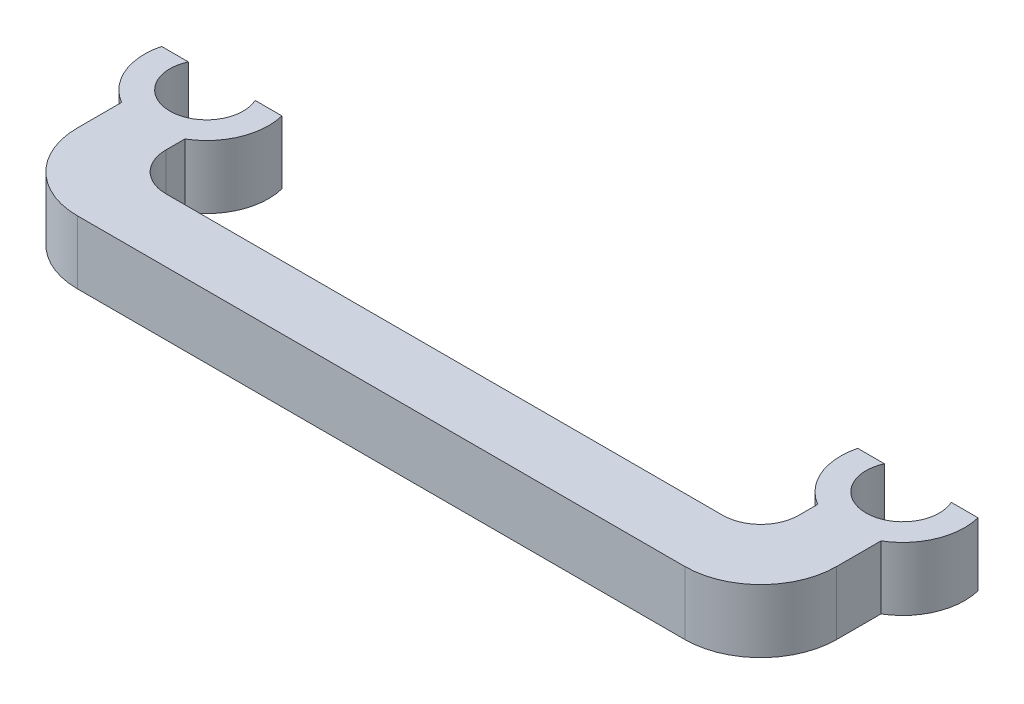
ISO-10303-21;
HEADER;
FILE_DESCRIPTION(('STEP AP214'),'2;1');
FILE_NAME('part.step','',(''),(''),'','','');
FILE_SCHEMA(('AUTOMOTIVE_DESIGN { 1 0 10303 214 1 1 1 1 }'));
ENDSEC;
DATA;
#1=APPLICATION_CONTEXT('core data for automotive mechanical design processes');
#2=APPLICATION_PROTOCOL_DEFINITION('international standard','automotive_design',2000,#1);
#3=PRODUCT_CONTEXT('',#1,'mechanical');
#4=PRODUCT('Part','Part','',(#3));
#5=PRODUCT_RELATED_PRODUCT_CATEGORY('part','',(#4));
#6=PRODUCT_DEFINITION_FORMATION('','',#4);
#7=PRODUCT_DEFINITION_CONTEXT('part definition',#1,'design');
#8=PRODUCT_DEFINITION('design','',#6,#7);
#9=PRODUCT_DEFINITION_SHAPE('','',#8);
#10=(LENGTH_UNIT() NAMED_UNIT(*) SI_UNIT(.MILLI.,.METRE.));
#11=(NAMED_UNIT(*) PLANE_ANGLE_UNIT() SI_UNIT($,.RADIAN.));
#12=(NAMED_UNIT(*) SI_UNIT($,.STERADIAN.) SOLID_ANGLE_UNIT());
#13=UNCERTAINTY_MEASURE_WITH_UNIT(LENGTH_MEASURE(1.E-05),#10,'distance_accuracy_value','');
#14=(GEOMETRIC_REPRESENTATION_CONTEXT(3) GLOBAL_UNCERTAINTY_ASSIGNED_CONTEXT((#13)) GLOBAL_UNIT_ASSIGNED_CONTEXT((#10,
#11,#12)) REPRESENTATION_CONTEXT('',''));
#15=CARTESIAN_POINT('',(0.,0.,0.));
#16=DIRECTION('',(0.,0.,1.));
#17=DIRECTION('',(1.,0.,0.));
#18=AXIS2_PLACEMENT_3D('',#15,#16,#17);
#19=CARTESIAN_POINT('',(-27.5,5.,-11.2142615011411));
#20=DIRECTION('',(0.,-1.,0.));
#21=DIRECTION('',(0.,0.,-1.));
#22=AXIS2_PLACEMENT_3D('',#19,#20,#21);
#23=CYLINDRICAL_SURFACE('',#22,4.9);
#24=CARTESIAN_POINT('',(-27.5,0.,-11.2142615011411));
#25=DIRECTION('',(0.,1.,0.));
#26=DIRECTION('',(0.,0.,1.));
#27=AXIS2_PLACEMENT_3D('',#24,#25,#26);
#28=CIRCLE('',#27,4.9);
#29=CARTESIAN_POINT('',(-32.2507894080879,0.,-12.4142615011411));
#30=VERTEX_POINT('',#29);
#31=CARTESIAN_POINT('',(-30.,0.,-7.));
#32=VERTEX_POINT('',#31);
#33=EDGE_CURVE('E191',#30,#32,#28,.T.);
#34=ORIENTED_EDGE('',*,*,#33,.T.);
#35=DIRECTION('',(0.,-1.,0.));
#36=VECTOR('',#35,1.);
#37=CARTESIAN_POINT('',(-30.,5.,-7.));
#38=LINE('',#37,#36);
#39=CARTESIAN_POINT('',(-30.,5.,-7.));
#40=VERTEX_POINT('',#39);
#41=EDGE_CURVE('E174',#40,#32,#38,.T.);
#42=ORIENTED_EDGE('',*,*,#41,.F.);
#43=CARTESIAN_POINT('',(-27.5,5.,-11.2142615011411));
#44=DIRECTION('',(0.,1.,0.));
#45=DIRECTION('',(0.,0.,1.));
#46=AXIS2_PLACEMENT_3D('',#43,#44,#45);
#47=CIRCLE('',#46,4.9);
#48=CARTESIAN_POINT('',(-32.2507894080879,5.,-12.4142615011411));
#49=VERTEX_POINT('',#48);
#50=EDGE_CURVE('E177',#49,#40,#47,.T.);
#51=ORIENTED_EDGE('',*,*,#50,.F.);
#52=DIRECTION('',(0.,-1.,0.));
#53=VECTOR('',#52,1.);
#54=CARTESIAN_POINT('',(-32.2507894080879,5.,-12.4142615011411));
#55=LINE('',#54,#53);
#56=EDGE_CURVE('E288',#49,#30,#55,.T.);
#57=ORIENTED_EDGE('',*,*,#56,.T.);
#58=EDGE_LOOP('',(#34,#42,#51,#57));
#59=FACE_BOUND('',#58,.T.);
#60=ADVANCED_FACE('F35',(#59),#23,.T.);
#61=CARTESIAN_POINT('',(-30.,5.,0.));
#62=DIRECTION('',(1.,0.,0.));
#63=DIRECTION('',(0.,0.,-1.));
#64=AXIS2_PLACEMENT_3D('',#61,#62,#63);
#65=PLANE('',#64);
#66=DIRECTION('',(0.,0.,1.));
#67=VECTOR('',#66,1.);
#68=CARTESIAN_POINT('',(-30.,0.,0.));
#69=LINE('',#68,#67);
#70=CARTESIAN_POINT('',(-30.,0.,-3.49999999999999));
#71=VERTEX_POINT('',#70);
#72=EDGE_CURVE('E254',#32,#71,#69,.T.);
#73=ORIENTED_EDGE('',*,*,#72,.T.);
#74=DIRECTION('',(0.,-1.,0.));
#75=VECTOR('',#74,1.);
#76=CARTESIAN_POINT('',(-30.,5.,-3.49999999999999));
#77=LINE('',#76,#75);
#78=CARTESIAN_POINT('',(-30.,5.,-3.49999999999999));
#79=VERTEX_POINT('',#78);
#80=EDGE_CURVE('E11',#71,#79,#77,.F.);
#81=ORIENTED_EDGE('',*,*,#80,.T.);
#82=DIRECTION('',(0.,0.,1.));
#83=VECTOR('',#82,1.);
#84=CARTESIAN_POINT('',(-30.,5.,0.));
#85=LINE('',#84,#83);
#86=EDGE_CURVE('E170',#40,#79,#85,.T.);
#87=ORIENTED_EDGE('',*,*,#86,.F.);
#88=ORIENTED_EDGE('',*,*,#41,.T.);
#89=EDGE_LOOP('',(#73,#81,#87,#88));
#90=FACE_BOUND('',#89,.T.);
#91=ADVANCED_FACE('F172',(#90),#65,.F.);
#92=CARTESIAN_POINT('',(0.,5.,2.50000000000001));
#93=DIRECTION('',(0.,0.,1.));
#94=DIRECTION('',(1.,0.,0.));
#95=AXIS2_PLACEMENT_3D('',#92,#93,#94);
#96=PLANE('',#95);
#97=DIRECTION('',(-1.,0.,0.));
#98=VECTOR('',#97,1.);
#99=CARTESIAN_POINT('',(0.,0.,2.50000000000001));
#100=LINE('',#99,#98);
#101=CARTESIAN_POINT('',(24.,0.,2.5));
#102=VERTEX_POINT('',#101);
#103=CARTESIAN_POINT('',(-24.,0.,2.50000000000001));
#104=VERTEX_POINT('',#103);
#105=EDGE_CURVE('E248',#102,#104,#100,.T.);
#106=ORIENTED_EDGE('',*,*,#105,.F.);
#107=DIRECTION('',(0.,-1.,0.));
#108=VECTOR('',#107,1.);
#109=CARTESIAN_POINT('',(24.,5.,2.5));
#110=LINE('',#109,#108);
#111=CARTESIAN_POINT('',(24.,5.,2.5));
#112=VERTEX_POINT('',#111);
#113=EDGE_CURVE('E226',#102,#112,#110,.F.);
#114=ORIENTED_EDGE('',*,*,#113,.T.);
#115=DIRECTION('',(-1.,0.,0.));
#116=VECTOR('',#115,1.);
#117=CARTESIAN_POINT('',(0.,5.,2.50000000000001));
#118=LINE('',#117,#116);
#119=CARTESIAN_POINT('',(-24.,5.,2.50000000000001));
#120=VERTEX_POINT('',#119);
#121=EDGE_CURVE('E176',#112,#120,#118,.T.);
#122=ORIENTED_EDGE('',*,*,#121,.T.);
#123=DIRECTION('',(0.,-1.,0.));
#124=VECTOR('',#123,1.);
#125=CARTESIAN_POINT('',(-24.,0.,2.50000000000001));
#126=LINE('',#125,#124);
#127=EDGE_CURVE('E223',#120,#104,#126,.T.);
#128=ORIENTED_EDGE('',*,*,#127,.T.);
#129=EDGE_LOOP('',(#106,#114,#122,#128));
#130=FACE_BOUND('',#129,.T.);
#131=ADVANCED_FACE('F252',(#130),#96,.T.);
#132=CARTESIAN_POINT('',(30.,5.,0.));
#133=DIRECTION('',(1.,0.,0.));
#134=DIRECTION('',(0.,0.,-1.));
#135=AXIS2_PLACEMENT_3D('',#132,#133,#134);
#136=PLANE('',#135);
#137=DIRECTION('',(0.,0.,1.));
#138=VECTOR('',#137,1.);
#139=CARTESIAN_POINT('',(30.,5.,0.));
#140=LINE('',#139,#138);
#141=CARTESIAN_POINT('',(30.,5.,-7.));
#142=VERTEX_POINT('',#141);
#143=CARTESIAN_POINT('',(30.,5.,-3.5));
#144=VERTEX_POINT('',#143);
#145=EDGE_CURVE('E232',#142,#144,#140,.T.);
#146=ORIENTED_EDGE('',*,*,#145,.T.);
#147=DIRECTION('',(0.,-1.,0.));
#148=VECTOR('',#147,1.);
#149=CARTESIAN_POINT('',(30.,5.,-3.5));
#150=LINE('',#149,#148);
#151=CARTESIAN_POINT('',(30.,0.,-3.5));
#152=VERTEX_POINT('',#151);
#153=EDGE_CURVE('E216',#144,#152,#150,.T.);
#154=ORIENTED_EDGE('',*,*,#153,.T.);
#155=DIRECTION('',(0.,0.,1.));
#156=VECTOR('',#155,1.);
#157=CARTESIAN_POINT('',(30.,0.,0.));
#158=LINE('',#157,#156);
#159=CARTESIAN_POINT('',(30.,0.,-7.));
#160=VERTEX_POINT('',#159);
#161=EDGE_CURVE('E250',#160,#152,#158,.T.);
#162=ORIENTED_EDGE('',*,*,#161,.F.);
#163=DIRECTION('',(0.,-1.,0.));
#164=VECTOR('',#163,1.);
#165=CARTESIAN_POINT('',(30.,5.,-7.));
#166=LINE('',#165,#164);
#167=EDGE_CURVE('E193',#142,#160,#166,.T.);
#168=ORIENTED_EDGE('',*,*,#167,.F.);
#169=EDGE_LOOP('',(#146,#154,#162,#168));
#170=FACE_BOUND('',#169,.T.);
#171=ADVANCED_FACE('F238',(#170),#136,.T.);
#172=CARTESIAN_POINT('',(27.5,5.,-11.2142615011411));
#173=DIRECTION('',(0.,-1.,0.));
#174=DIRECTION('',(0.,0.,-1.));
#175=AXIS2_PLACEMENT_3D('',#172,#173,#174);
#176=CYLINDRICAL_SURFACE('',#175,4.9);
#177=CARTESIAN_POINT('',(27.5,0.,-11.2142615011411));
#178=DIRECTION('',(0.,1.,0.));
#179=DIRECTION('',(0.,0.,1.));
#180=AXIS2_PLACEMENT_3D('',#177,#178,#179);
#181=CIRCLE('',#180,4.9);
#182=CARTESIAN_POINT('',(32.2507894080879,0.,-12.4142615011411));
#183=VERTEX_POINT('',#182);
#184=EDGE_CURVE('E256',#183,#160,#181,.F.);
#185=ORIENTED_EDGE('',*,*,#184,.F.);
#186=DIRECTION('',(0.,-1.,0.));
#187=VECTOR('',#186,1.);
#188=CARTESIAN_POINT('',(32.2507894080879,5.,-12.4142615011411));
#189=LINE('',#188,#187);
#190=CARTESIAN_POINT('',(32.2507894080879,5.,-12.4142615011411));
#191=VERTEX_POINT('',#190);
#192=EDGE_CURVE('E197',#191,#183,#189,.T.);
#193=ORIENTED_EDGE('',*,*,#192,.F.);
#194=CARTESIAN_POINT('',(27.5,5.,-11.2142615011411));
#195=DIRECTION('',(0.,1.,0.));
#196=DIRECTION('',(0.,0.,1.));
#197=AXIS2_PLACEMENT_3D('',#194,#195,#196);
#198=CIRCLE('',#197,4.9);
#199=EDGE_CURVE('E241',#191,#142,#198,.F.);
#200=ORIENTED_EDGE('',*,*,#199,.T.);
#201=ORIENTED_EDGE('',*,*,#167,.T.);
#202=EDGE_LOOP('',(#185,#193,#200,#201));
#203=FACE_BOUND('',#202,.T.);
#204=ADVANCED_FACE('F314',(#203),#176,.T.);
#205=CARTESIAN_POINT('',(0.,5.,-12.4142615011411));
#206=DIRECTION('',(0.,0.,-1.));
#207=DIRECTION('',(-1.,0.,0.));
#208=AXIS2_PLACEMENT_3D('',#205,#206,#207);
#209=PLANE('',#208);
#210=DIRECTION('',(1.,0.,0.));
#211=VECTOR('',#210,1.);
#212=CARTESIAN_POINT('',(0.,0.,-12.4142615011411));
#213=LINE('',#212,#211);
#214=CARTESIAN_POINT('',(30.1400757564888,0.,-12.4142615011411));
#215=VERTEX_POINT('',#214);
#216=EDGE_CURVE('E262',#215,#183,#213,.T.);
#217=ORIENTED_EDGE('',*,*,#216,.F.);
#218=DIRECTION('',(0.,-1.,0.));
#219=VECTOR('',#218,1.);
#220=CARTESIAN_POINT('',(30.1400757564888,5.,-12.4142615011411));
#221=LINE('',#220,#219);
#222=CARTESIAN_POINT('',(30.1400757564888,5.,-12.4142615011411));
#223=VERTEX_POINT('',#222);
#224=EDGE_CURVE('E305',#223,#215,#221,.T.);
#225=ORIENTED_EDGE('',*,*,#224,.F.);
#226=DIRECTION('',(1.,0.,0.));
#227=VECTOR('',#226,1.);
#228=CARTESIAN_POINT('',(0.,5.,-12.4142615011411));
#229=LINE('',#228,#227);
#230=EDGE_CURVE('E312',#223,#191,#229,.T.);
#231=ORIENTED_EDGE('',*,*,#230,.T.);
#232=ORIENTED_EDGE('',*,*,#192,.T.);
#233=EDGE_LOOP('',(#217,#225,#231,#232));
#234=FACE_BOUND('',#233,.T.);
#235=ADVANCED_FACE('F310',(#234),#209,.T.);
#236=CARTESIAN_POINT('',(27.5,5.,-11.2142615011411));
#237=DIRECTION('',(0.,-1.,0.));
#238=DIRECTION('',(0.,0.,-1.));
#239=AXIS2_PLACEMENT_3D('',#236,#237,#238);
#240=CYLINDRICAL_SURFACE('',#239,2.9);
#241=CARTESIAN_POINT('',(27.5,0.,-11.2142615011411));
#242=DIRECTION('',(0.,1.,0.));
#243=DIRECTION('',(0.,0.,1.));
#244=AXIS2_PLACEMENT_3D('',#241,#242,#243);
#245=CIRCLE('',#244,2.9);
#246=CARTESIAN_POINT('',(24.8599242435112,0.,-12.4142615011411));
#247=VERTEX_POINT('',#246);
#248=EDGE_CURVE('E266',#215,#247,#245,.F.);
#249=ORIENTED_EDGE('',*,*,#248,.T.);
#250=DIRECTION('',(0.,-1.,0.));
#251=VECTOR('',#250,1.);
#252=CARTESIAN_POINT('',(24.8599242435112,5.,-12.4142615011411));
#253=LINE('',#252,#251);
#254=CARTESIAN_POINT('',(24.8599242435112,5.,-12.4142615011411));
#255=VERTEX_POINT('',#254);
#256=EDGE_CURVE('E302',#255,#247,#253,.T.);
#257=ORIENTED_EDGE('',*,*,#256,.F.);
#258=CARTESIAN_POINT('',(27.5,5.,-11.2142615011411));
#259=DIRECTION('',(0.,1.,0.));
#260=DIRECTION('',(0.,0.,1.));
#261=AXIS2_PLACEMENT_3D('',#258,#259,#260);
#262=CIRCLE('',#261,2.9);
#263=EDGE_CURVE('E330',#223,#255,#262,.F.);
#264=ORIENTED_EDGE('',*,*,#263,.F.);
#265=ORIENTED_EDGE('',*,*,#224,.T.);
#266=EDGE_LOOP('',(#249,#257,#264,#265));
#267=FACE_BOUND('',#266,.T.);
#268=ADVANCED_FACE('F320',(#267),#240,.F.);
#269=CARTESIAN_POINT('',(0.,5.,-12.4142615011411));
#270=DIRECTION('',(0.,0.,1.));
#271=DIRECTION('',(1.,0.,0.));
#272=AXIS2_PLACEMENT_3D('',#269,#270,#271);
#273=PLANE('',#272);
#274=DIRECTION('',(-1.,0.,0.));
#275=VECTOR('',#274,1.);
#276=CARTESIAN_POINT('',(0.,0.,-12.4142615011411));
#277=LINE('',#276,#275);
#278=CARTESIAN_POINT('',(22.7492105919121,0.,-12.4142615011411));
#279=VERTEX_POINT('',#278);
#280=EDGE_CURVE('E268',#247,#279,#277,.T.);
#281=ORIENTED_EDGE('',*,*,#280,.T.);
#282=DIRECTION('',(0.,-1.,0.));
#283=VECTOR('',#282,1.);
#284=CARTESIAN_POINT('',(22.7492105919121,5.,-12.4142615011411));
#285=LINE('',#284,#283);
#286=CARTESIAN_POINT('',(22.7492105919121,5.,-12.4142615011411));
#287=VERTEX_POINT('',#286);
#288=EDGE_CURVE('E300',#287,#279,#285,.T.);
#289=ORIENTED_EDGE('',*,*,#288,.F.);
#290=DIRECTION('',(-1.,0.,0.));
#291=VECTOR('',#290,1.);
#292=CARTESIAN_POINT('',(0.,5.,-12.4142615011411));
#293=LINE('',#292,#291);
#294=EDGE_CURVE('E326',#255,#287,#293,.T.);
#295=ORIENTED_EDGE('',*,*,#294,.F.);
#296=ORIENTED_EDGE('',*,*,#256,.T.);
#297=EDGE_LOOP('',(#281,#289,#295,#296));
#298=FACE_BOUND('',#297,.T.);
#299=ADVANCED_FACE('F324',(#298),#273,.F.);
#300=CARTESIAN_POINT('',(25.,0.,-7.));
#301=VERTEX_POINT('',#300);
#302=EDGE_CURVE('E263',#301,#279,#181,.F.);
#303=ORIENTED_EDGE('',*,*,#302,.F.);
#304=DIRECTION('',(0.,-1.,0.));
#305=VECTOR('',#304,1.);
#306=CARTESIAN_POINT('',(25.,5.,-7.));
#307=LINE('',#306,#305);
#308=CARTESIAN_POINT('',(25.,5.,-7.));
#309=VERTEX_POINT('',#308);
#310=EDGE_CURVE('E298',#309,#301,#307,.T.);
#311=ORIENTED_EDGE('',*,*,#310,.F.);
#312=EDGE_CURVE('E329',#309,#287,#198,.F.);
#313=ORIENTED_EDGE('',*,*,#312,.T.);
#314=ORIENTED_EDGE('',*,*,#288,.T.);
#315=EDGE_LOOP('',(#303,#311,#313,#314));
#316=FACE_BOUND('',#315,.T.);
#317=ADVANCED_FACE('F400',(#316),#176,.T.);
#318=CARTESIAN_POINT('',(25.,5.,0.));
#319=DIRECTION('',(1.,0.,0.));
#320=DIRECTION('',(0.,0.,-1.));
#321=AXIS2_PLACEMENT_3D('',#318,#319,#320);
#322=PLANE('',#321);
#323=DIRECTION('',(0.,0.,1.));
#324=VECTOR('',#323,1.);
#325=CARTESIAN_POINT('',(25.,0.,0.));
#326=LINE('',#325,#324);
#327=CARTESIAN_POINT('',(25.,0.,-5.5));
#328=VERTEX_POINT('',#327);
#329=EDGE_CURVE('E271',#301,#328,#326,.T.);
#330=ORIENTED_EDGE('',*,*,#329,.T.);
#331=DIRECTION('',(0.,-1.,0.));
#332=VECTOR('',#331,1.);
#333=CARTESIAN_POINT('',(25.,5.,-5.5));
#334=LINE('',#333,#332);
#335=CARTESIAN_POINT('',(25.,5.,-5.5));
#336=VERTEX_POINT('',#335);
#337=EDGE_CURVE('E203',#328,#336,#334,.F.);
#338=ORIENTED_EDGE('',*,*,#337,.T.);
#339=DIRECTION('',(0.,0.,1.));
#340=VECTOR('',#339,1.);
#341=CARTESIAN_POINT('',(25.,5.,0.));
#342=LINE('',#341,#340);
#343=EDGE_CURVE('E332',#309,#336,#342,.T.);
#344=ORIENTED_EDGE('',*,*,#343,.F.);
#345=ORIENTED_EDGE('',*,*,#310,.T.);
#346=EDGE_LOOP('',(#330,#338,#344,#345));
#347=FACE_BOUND('',#346,.T.);
#348=ADVANCED_FACE('F394',(#347),#322,.F.);
#349=CARTESIAN_POINT('',(0.,5.,-2.5));
#350=DIRECTION('',(0.,0.,1.));
#351=DIRECTION('',(1.,0.,0.));
#352=AXIS2_PLACEMENT_3D('',#349,#350,#351);
#353=PLANE('',#352);
#354=DIRECTION('',(-1.,0.,0.));
#355=VECTOR('',#354,1.);
#356=CARTESIAN_POINT('',(0.,5.,-2.5));
#357=LINE('',#356,#355);
#358=CARTESIAN_POINT('',(22.,5.,-2.5));
#359=VERTEX_POINT('',#358);
#360=CARTESIAN_POINT('',(-22.,5.,-2.5));
#361=VERTEX_POINT('',#360);
#362=EDGE_CURVE('E339',#359,#361,#357,.T.);
#363=ORIENTED_EDGE('',*,*,#362,.F.);
#364=DIRECTION('',(0.,-1.,0.));
#365=VECTOR('',#364,1.);
#366=CARTESIAN_POINT('',(22.,0.,-2.5));
#367=LINE('',#366,#365);
#368=CARTESIAN_POINT('',(22.,0.,-2.5));
#369=VERTEX_POINT('',#368);
#370=EDGE_CURVE('E195',#359,#369,#367,.T.);
#371=ORIENTED_EDGE('',*,*,#370,.T.);
#372=DIRECTION('',(-1.,0.,0.));
#373=VECTOR('',#372,1.);
#374=CARTESIAN_POINT('',(0.,0.,-2.5));
#375=LINE('',#374,#373);
#376=CARTESIAN_POINT('',(-22.,0.,-2.5));
#377=VERTEX_POINT('',#376);
#378=EDGE_CURVE('E274',#369,#377,#375,.T.);
#379=ORIENTED_EDGE('',*,*,#378,.T.);
#380=DIRECTION('',(0.,-1.,0.));
#381=VECTOR('',#380,1.);
#382=CARTESIAN_POINT('',(-22.,5.,-2.5));
#383=LINE('',#382,#381);
#384=EDGE_CURVE('E192',#377,#361,#383,.F.);
#385=ORIENTED_EDGE('',*,*,#384,.T.);
#386=EDGE_LOOP('',(#363,#371,#379,#385));
#387=FACE_BOUND('',#386,.T.);
#388=ADVANCED_FACE('F389',(#387),#353,.F.);
#389=CARTESIAN_POINT('',(-25.,5.,0.));
#390=DIRECTION('',(1.,0.,0.));
#391=DIRECTION('',(0.,0.,-1.));
#392=AXIS2_PLACEMENT_3D('',#389,#390,#391);
#393=PLANE('',#392);
#394=DIRECTION('',(0.,0.,1.));
#395=VECTOR('',#394,1.);
#396=CARTESIAN_POINT('',(-25.,5.,0.));
#397=LINE('',#396,#395);
#398=CARTESIAN_POINT('',(-25.,5.,-7.));
#399=VERTEX_POINT('',#398);
#400=CARTESIAN_POINT('',(-25.,5.,-5.49999999999999));
#401=VERTEX_POINT('',#400);
#402=EDGE_CURVE('E342',#399,#401,#397,.T.);
#403=ORIENTED_EDGE('',*,*,#402,.T.);
#404=DIRECTION('',(0.,-1.,0.));
#405=VECTOR('',#404,1.);
#406=CARTESIAN_POINT('',(-25.,5.,-5.49999999999999));
#407=LINE('',#406,#405);
#408=CARTESIAN_POINT('',(-25.,0.,-5.49999999999999));
#409=VERTEX_POINT('',#408);
#410=EDGE_CURVE('E205',#401,#409,#407,.T.);
#411=ORIENTED_EDGE('',*,*,#410,.T.);
#412=DIRECTION('',(0.,0.,1.));
#413=VECTOR('',#412,1.);
#414=CARTESIAN_POINT('',(-25.,0.,0.));
#415=LINE('',#414,#413);
#416=CARTESIAN_POINT('',(-25.,0.,-7.));
#417=VERTEX_POINT('',#416);
#418=EDGE_CURVE('E277',#417,#409,#415,.T.);
#419=ORIENTED_EDGE('',*,*,#418,.F.);
#420=DIRECTION('',(0.,-1.,0.));
#421=VECTOR('',#420,1.);
#422=CARTESIAN_POINT('',(-25.,5.,-7.));
#423=LINE('',#422,#421);
#424=EDGE_CURVE('E296',#399,#417,#423,.T.);
#425=ORIENTED_EDGE('',*,*,#424,.F.);
#426=EDGE_LOOP('',(#403,#411,#419,#425));
#427=FACE_BOUND('',#426,.T.);
#428=ADVANCED_FACE('F384',(#427),#393,.T.);
#429=CARTESIAN_POINT('',(-22.7492105919121,0.,-12.4142615011411));
#430=VERTEX_POINT('',#429);
#431=EDGE_CURVE('E280',#417,#430,#28,.T.);
#432=ORIENTED_EDGE('',*,*,#431,.T.);
#433=DIRECTION('',(0.,-1.,0.));
#434=VECTOR('',#433,1.);
#435=CARTESIAN_POINT('',(-22.7492105919121,5.,-12.4142615011411));
#436=LINE('',#435,#434);
#437=CARTESIAN_POINT('',(-22.7492105919121,5.,-12.4142615011411));
#438=VERTEX_POINT('',#437);
#439=EDGE_CURVE('E294',#438,#430,#436,.T.);
#440=ORIENTED_EDGE('',*,*,#439,.F.);
#441=EDGE_CURVE('E189',#399,#438,#47,.T.);
#442=ORIENTED_EDGE('',*,*,#441,.F.);
#443=ORIENTED_EDGE('',*,*,#424,.T.);
#444=EDGE_LOOP('',(#432,#440,#442,#443));
#445=FACE_BOUND('',#444,.T.);
#446=ADVANCED_FACE('F355',(#445),#23,.T.);
#447=CARTESIAN_POINT('',(0.,5.,-12.4142615011411));
#448=DIRECTION('',(0.,0.,-1.));
#449=DIRECTION('',(-1.,0.,0.));
#450=AXIS2_PLACEMENT_3D('',#447,#448,#449);
#451=PLANE('',#450);
#452=DIRECTION('',(1.,0.,0.));
#453=VECTOR('',#452,1.);
#454=CARTESIAN_POINT('',(0.,0.,-12.4142615011411));
#455=LINE('',#454,#453);
#456=CARTESIAN_POINT('',(-24.8599242435112,0.,-12.4142615011411));
#457=VERTEX_POINT('',#456);
#458=EDGE_CURVE('E281',#457,#430,#455,.T.);
#459=ORIENTED_EDGE('',*,*,#458,.F.);
#460=DIRECTION('',(0.,-1.,0.));
#461=VECTOR('',#460,1.);
#462=CARTESIAN_POINT('',(-24.8599242435112,5.,-12.4142615011411));
#463=LINE('',#462,#461);
#464=CARTESIAN_POINT('',(-24.8599242435112,5.,-12.4142615011411));
#465=VERTEX_POINT('',#464);
#466=EDGE_CURVE('E292',#465,#457,#463,.T.);
#467=ORIENTED_EDGE('',*,*,#466,.F.);
#468=DIRECTION('',(1.,0.,0.));
#469=VECTOR('',#468,1.);
#470=CARTESIAN_POINT('',(0.,5.,-12.4142615011411));
#471=LINE('',#470,#469);
#472=EDGE_CURVE('E345',#465,#438,#471,.T.);
#473=ORIENTED_EDGE('',*,*,#472,.T.);
#474=ORIENTED_EDGE('',*,*,#439,.T.);
#475=EDGE_LOOP('',(#459,#467,#473,#474));
#476=FACE_BOUND('',#475,.T.);
#477=ADVANCED_FACE('F362',(#476),#451,.T.);
#478=CARTESIAN_POINT('',(-27.5,5.,-11.2142615011411));
#479=DIRECTION('',(0.,-1.,0.));
#480=DIRECTION('',(0.,0.,-1.));
#481=AXIS2_PLACEMENT_3D('',#478,#479,#480);
#482=CYLINDRICAL_SURFACE('',#481,2.9);
#483=CARTESIAN_POINT('',(-27.5,0.,-11.2142615011411));
#484=DIRECTION('',(0.,1.,0.));
#485=DIRECTION('',(0.,0.,1.));
#486=AXIS2_PLACEMENT_3D('',#483,#484,#485);
#487=CIRCLE('',#486,2.9);
#488=CARTESIAN_POINT('',(-30.1400757564888,0.,-12.4142615011411));
#489=VERTEX_POINT('',#488);
#490=EDGE_CURVE('E284',#489,#457,#487,.T.);
#491=ORIENTED_EDGE('',*,*,#490,.F.);
#492=DIRECTION('',(0.,-1.,0.));
#493=VECTOR('',#492,1.);
#494=CARTESIAN_POINT('',(-30.1400757564888,5.,-12.4142615011411));
#495=LINE('',#494,#493);
#496=CARTESIAN_POINT('',(-30.1400757564888,5.,-12.4142615011411));
#497=VERTEX_POINT('',#496);
#498=EDGE_CURVE('E290',#497,#489,#495,.T.);
#499=ORIENTED_EDGE('',*,*,#498,.F.);
#500=CARTESIAN_POINT('',(-27.5,5.,-11.2142615011411));
#501=DIRECTION('',(0.,1.,0.));
#502=DIRECTION('',(0.,0.,1.));
#503=AXIS2_PLACEMENT_3D('',#500,#501,#502);
#504=CIRCLE('',#503,2.9);
#505=EDGE_CURVE('E348',#497,#465,#504,.T.);
#506=ORIENTED_EDGE('',*,*,#505,.T.);
#507=ORIENTED_EDGE('',*,*,#466,.T.);
#508=EDGE_LOOP('',(#491,#499,#506,#507));
#509=FACE_BOUND('',#508,.T.);
#510=ADVANCED_FACE('F366',(#509),#482,.F.);
#511=CARTESIAN_POINT('',(0.,5.,-12.4142615011411));
#512=DIRECTION('',(0.,0.,1.));
#513=DIRECTION('',(1.,0.,0.));
#514=AXIS2_PLACEMENT_3D('',#511,#512,#513);
#515=PLANE('',#514);
#516=DIRECTION('',(-1.,0.,0.));
#517=VECTOR('',#516,1.);
#518=CARTESIAN_POINT('',(0.,0.,-12.4142615011411));
#519=LINE('',#518,#517);
#520=EDGE_CURVE('E187',#489,#30,#519,.T.);
#521=ORIENTED_EDGE('',*,*,#520,.T.);
#522=ORIENTED_EDGE('',*,*,#56,.F.);
#523=DIRECTION('',(-1.,0.,0.));
#524=VECTOR('',#523,1.);
#525=CARTESIAN_POINT('',(0.,5.,-12.4142615011411));
#526=LINE('',#525,#524);
#527=EDGE_CURVE('E183',#497,#49,#526,.T.);
#528=ORIENTED_EDGE('',*,*,#527,.F.);
#529=ORIENTED_EDGE('',*,*,#498,.T.);
#530=EDGE_LOOP('',(#521,#522,#528,#529));
#531=FACE_BOUND('',#530,.T.);
#532=ADVANCED_FACE('F368',(#531),#515,.F.);
#533=CARTESIAN_POINT('',(0.,5.,0.));
#534=DIRECTION('',(0.,1.,0.));
#535=DIRECTION('',(0.,0.,1.));
#536=AXIS2_PLACEMENT_3D('',#533,#534,#535);
#537=PLANE('',#536);
#538=ORIENTED_EDGE('',*,*,#121,.F.);
#539=CARTESIAN_POINT('',(24.,5.,-3.5));
#540=DIRECTION('',(0.,1.,0.));
#541=DIRECTION('',(0.,0.,1.));
#542=AXIS2_PLACEMENT_3D('',#539,#540,#541);
#543=CIRCLE('',#542,6.);
#544=EDGE_CURVE('E43',#112,#144,#543,.T.);
#545=ORIENTED_EDGE('',*,*,#544,.T.);
#546=ORIENTED_EDGE('',*,*,#145,.F.);
#547=ORIENTED_EDGE('',*,*,#199,.F.);
#548=ORIENTED_EDGE('',*,*,#230,.F.);
#549=ORIENTED_EDGE('',*,*,#263,.T.);
#550=ORIENTED_EDGE('',*,*,#294,.T.);
#551=ORIENTED_EDGE('',*,*,#312,.F.);
#552=ORIENTED_EDGE('',*,*,#343,.T.);
#553=CARTESIAN_POINT('',(22.,5.,-5.5));
#554=DIRECTION('',(0.,1.,0.));
#555=DIRECTION('',(0.,0.,1.));
#556=AXIS2_PLACEMENT_3D('',#553,#554,#555);
#557=CIRCLE('',#556,3.);
#558=EDGE_CURVE('E210',#336,#359,#557,.F.);
#559=ORIENTED_EDGE('',*,*,#558,.T.);
#560=ORIENTED_EDGE('',*,*,#362,.T.);
#561=CARTESIAN_POINT('',(-22.,5.,-5.5));
#562=DIRECTION('',(0.,1.,0.));
#563=DIRECTION('',(0.,0.,1.));
#564=AXIS2_PLACEMENT_3D('',#561,#562,#563);
#565=CIRCLE('',#564,3.);
#566=EDGE_CURVE('E214',#361,#401,#565,.F.);
#567=ORIENTED_EDGE('',*,*,#566,.T.);
#568=ORIENTED_EDGE('',*,*,#402,.F.);
#569=ORIENTED_EDGE('',*,*,#441,.T.);
#570=ORIENTED_EDGE('',*,*,#472,.F.);
#571=ORIENTED_EDGE('',*,*,#505,.F.);
#572=ORIENTED_EDGE('',*,*,#527,.T.);
#573=ORIENTED_EDGE('',*,*,#50,.T.);
#574=ORIENTED_EDGE('',*,*,#86,.T.);
#575=CARTESIAN_POINT('',(-24.,5.,-3.49999999999999));
#576=DIRECTION('',(0.,1.,0.));
#577=DIRECTION('',(0.,0.,1.));
#578=AXIS2_PLACEMENT_3D('',#575,#576,#577);
#579=CIRCLE('',#578,6.);
#580=EDGE_CURVE('E55',#79,#120,#579,.T.);
#581=ORIENTED_EDGE('',*,*,#580,.T.);
#582=EDGE_LOOP('',(#538,#545,#546,#547,#548,#549,#550,#551,#552,#559,#560,#567,#568,#569,#570,
#571,#572,#573,#574,#581));
#583=FACE_BOUND('',#582,.T.);
#584=ADVANCED_FACE('F180',(#583),#537,.T.);
#585=CARTESIAN_POINT('',(0.,0.,0.));
#586=DIRECTION('',(0.,1.,0.));
#587=DIRECTION('',(0.,0.,1.));
#588=AXIS2_PLACEMENT_3D('',#585,#586,#587);
#589=PLANE('',#588);
#590=ORIENTED_EDGE('',*,*,#161,.T.);
#591=CARTESIAN_POINT('',(24.,0.,-3.5));
#592=DIRECTION('',(0.,1.,0.));
#593=DIRECTION('',(0.,0.,1.));
#594=AXIS2_PLACEMENT_3D('',#591,#592,#593);
#595=CIRCLE('',#594,6.);
#596=EDGE_CURVE('E221',#152,#102,#595,.F.);
#597=ORIENTED_EDGE('',*,*,#596,.T.);
#598=ORIENTED_EDGE('',*,*,#105,.T.);
#599=CARTESIAN_POINT('',(-24.,0.,-3.49999999999999));
#600=DIRECTION('',(0.,1.,0.));
#601=DIRECTION('',(0.,0.,1.));
#602=AXIS2_PLACEMENT_3D('',#599,#600,#601);
#603=CIRCLE('',#602,6.);
#604=EDGE_CURVE('E219',#104,#71,#603,.F.);
#605=ORIENTED_EDGE('',*,*,#604,.T.);
#606=ORIENTED_EDGE('',*,*,#72,.F.);
#607=ORIENTED_EDGE('',*,*,#33,.F.);
#608=ORIENTED_EDGE('',*,*,#520,.F.);
#609=ORIENTED_EDGE('',*,*,#490,.T.);
#610=ORIENTED_EDGE('',*,*,#458,.T.);
#611=ORIENTED_EDGE('',*,*,#431,.F.);
#612=ORIENTED_EDGE('',*,*,#418,.T.);
#613=CARTESIAN_POINT('',(-22.,0.,-5.5));
#614=DIRECTION('',(0.,1.,0.));
#615=DIRECTION('',(0.,0.,1.));
#616=AXIS2_PLACEMENT_3D('',#613,#614,#615);
#617=CIRCLE('',#616,3.);
#618=EDGE_CURVE('E212',#409,#377,#617,.T.);
#619=ORIENTED_EDGE('',*,*,#618,.T.);
#620=ORIENTED_EDGE('',*,*,#378,.F.);
#621=CARTESIAN_POINT('',(22.,0.,-5.5));
#622=DIRECTION('',(0.,1.,0.));
#623=DIRECTION('',(0.,0.,1.));
#624=AXIS2_PLACEMENT_3D('',#621,#622,#623);
#625=CIRCLE('',#624,3.);
#626=EDGE_CURVE('E208',#369,#328,#625,.T.);
#627=ORIENTED_EDGE('',*,*,#626,.T.);
#628=ORIENTED_EDGE('',*,*,#329,.F.);
#629=ORIENTED_EDGE('',*,*,#302,.T.);
#630=ORIENTED_EDGE('',*,*,#280,.F.);
#631=ORIENTED_EDGE('',*,*,#248,.F.);
#632=ORIENTED_EDGE('',*,*,#216,.T.);
#633=ORIENTED_EDGE('',*,*,#184,.T.);
#634=EDGE_LOOP('',(#590,#597,#598,#605,#606,#607,#608,#609,#610,#611,#612,#619,#620,#627,#628,
#629,#630,#631,#632,#633));
#635=FACE_BOUND('',#634,.T.);
#636=ADVANCED_FACE('F247',(#635),#589,.F.);
#637=CARTESIAN_POINT('',(22.,5.,-5.5));
#638=DIRECTION('',(0.,1.,0.));
#639=DIRECTION('',(0.,0.,1.));
#640=AXIS2_PLACEMENT_3D('',#637,#638,#639);
#641=CYLINDRICAL_SURFACE('',#640,3.);
#642=ORIENTED_EDGE('',*,*,#558,.F.);
#643=ORIENTED_EDGE('',*,*,#337,.F.);
#644=ORIENTED_EDGE('',*,*,#626,.F.);
#645=ORIENTED_EDGE('',*,*,#370,.F.);
#646=EDGE_LOOP('',(#642,#643,#644,#645));
#647=FACE_BOUND('',#646,.T.);
#648=ADVANCED_FACE('F415',(#647),#641,.F.);
#649=CARTESIAN_POINT('',(-22.,5.,-5.5));
#650=DIRECTION('',(0.,-1.,0.));
#651=DIRECTION('',(0.,0.,-1.));
#652=AXIS2_PLACEMENT_3D('',#649,#650,#651);
#653=CYLINDRICAL_SURFACE('',#652,3.);
#654=ORIENTED_EDGE('',*,*,#566,.F.);
#655=ORIENTED_EDGE('',*,*,#384,.F.);
#656=ORIENTED_EDGE('',*,*,#618,.F.);
#657=ORIENTED_EDGE('',*,*,#410,.F.);
#658=EDGE_LOOP('',(#654,#655,#656,#657));
#659=FACE_BOUND('',#658,.T.);
#660=ADVANCED_FACE('F374',(#659),#653,.F.);
#661=CARTESIAN_POINT('',(24.,5.,-3.5));
#662=DIRECTION('',(0.,-1.,0.));
#663=DIRECTION('',(0.,0.,-1.));
#664=AXIS2_PLACEMENT_3D('',#661,#662,#663);
#665=CYLINDRICAL_SURFACE('',#664,6.);
#666=ORIENTED_EDGE('',*,*,#544,.F.);
#667=ORIENTED_EDGE('',*,*,#113,.F.);
#668=ORIENTED_EDGE('',*,*,#596,.F.);
#669=ORIENTED_EDGE('',*,*,#153,.F.);
#670=EDGE_LOOP('',(#666,#667,#668,#669));
#671=FACE_BOUND('',#670,.T.);
#672=ADVANCED_FACE('F243',(#671),#665,.T.);
#673=CARTESIAN_POINT('',(-24.,5.,-3.49999999999999));
#674=DIRECTION('',(0.,1.,0.));
#675=DIRECTION('',(0.,0.,1.));
#676=AXIS2_PLACEMENT_3D('',#673,#674,#675);
#677=CYLINDRICAL_SURFACE('',#676,6.);
#678=ORIENTED_EDGE('',*,*,#580,.F.);
#679=ORIENTED_EDGE('',*,*,#80,.F.);
#680=ORIENTED_EDGE('',*,*,#604,.F.);
#681=ORIENTED_EDGE('',*,*,#127,.F.);
#682=EDGE_LOOP('',(#678,#679,#680,#681));
#683=FACE_BOUND('',#682,.T.);
#684=ADVANCED_FACE('F37',(#683),#677,.T.);
#685=CLOSED_SHELL('',(#60,#91,#131,#171,#204,#235,#268,#299,#317,#348,#388,#428,#446,#477,#510,
#532,#584,#636,#648,#660,#672,#684));
#686=MANIFOLD_SOLID_BREP('B2',#685);
#687=ADVANCED_BREP_SHAPE_REPRESENTATION('',(#18,#686),#14);
#688=SHAPE_DEFINITION_REPRESENTATION(#9,#687);
ENDSEC;
END-ISO-10303-21;
